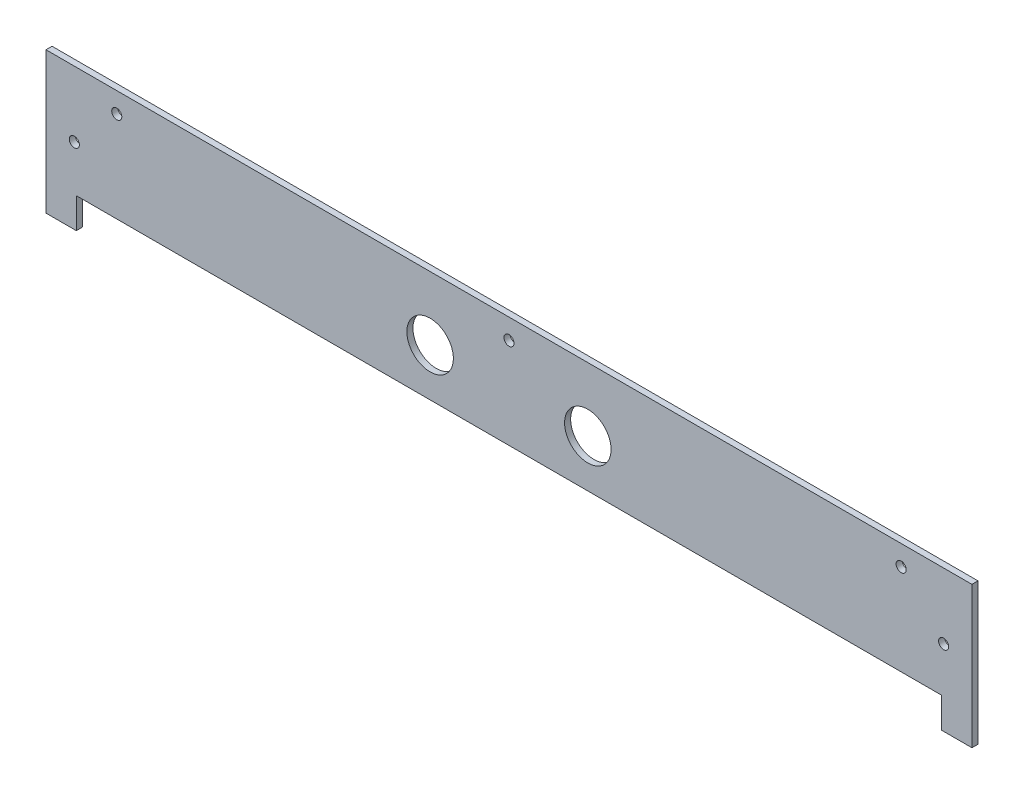
ISO-10303-21;
HEADER;
FILE_DESCRIPTION(('STEP AP214'),'2;1');
FILE_NAME('part.step','',(''),(''),'','','');
FILE_SCHEMA(('AUTOMOTIVE_DESIGN { 1 0 10303 214 1 1 1 1 }'));
ENDSEC;
DATA;
#1=APPLICATION_CONTEXT('core data for automotive mechanical design processes');
#2=APPLICATION_PROTOCOL_DEFINITION('international standard','automotive_design',2000,#1);
#3=PRODUCT_CONTEXT('',#1,'mechanical');
#4=PRODUCT('Part','Part','',(#3));
#5=PRODUCT_RELATED_PRODUCT_CATEGORY('part','',(#4));
#6=PRODUCT_DEFINITION_FORMATION('','',#4);
#7=PRODUCT_DEFINITION_CONTEXT('part definition',#1,'design');
#8=PRODUCT_DEFINITION('design','',#6,#7);
#9=PRODUCT_DEFINITION_SHAPE('','',#8);
#10=(LENGTH_UNIT() NAMED_UNIT(*) SI_UNIT(.MILLI.,.METRE.));
#11=(NAMED_UNIT(*) PLANE_ANGLE_UNIT() SI_UNIT($,.RADIAN.));
#12=(NAMED_UNIT(*) SI_UNIT($,.STERADIAN.) SOLID_ANGLE_UNIT());
#13=UNCERTAINTY_MEASURE_WITH_UNIT(LENGTH_MEASURE(1.E-05),#10,'distance_accuracy_value','');
#14=(GEOMETRIC_REPRESENTATION_CONTEXT(3) GLOBAL_UNCERTAINTY_ASSIGNED_CONTEXT((#13)) GLOBAL_UNIT_ASSIGNED_CONTEXT((#10,
#11,#12)) REPRESENTATION_CONTEXT('',''));
#15=CARTESIAN_POINT('',(0.,0.,0.));
#16=DIRECTION('',(0.,0.,1.));
#17=DIRECTION('',(1.,0.,0.));
#18=AXIS2_PLACEMENT_3D('',#15,#16,#17);
#19=CARTESIAN_POINT('',(229.,122.5,3.));
#20=DIRECTION('',(-1.,0.,0.));
#21=DIRECTION('',(0.,-1.,0.));
#22=AXIS2_PLACEMENT_3D('',#19,#20,#21);
#23=PLANE('',#22);
#24=DIRECTION('',(0.,1.,0.));
#25=VECTOR('',#24,1.);
#26=CARTESIAN_POINT('',(229.,122.5,3.));
#27=LINE('',#26,#25);
#28=CARTESIAN_POINT('',(229.,52.5,3.));
#29=VERTEX_POINT('',#28);
#30=CARTESIAN_POINT('',(229.,122.5,3.));
#31=VERTEX_POINT('',#30);
#32=EDGE_CURVE('E115',#29,#31,#27,.T.);
#33=ORIENTED_EDGE('',*,*,#32,.F.);
#34=DIRECTION('',(0.,0.,1.));
#35=VECTOR('',#34,1.);
#36=CARTESIAN_POINT('',(229.,52.5,-7.));
#37=LINE('',#36,#35);
#38=CARTESIAN_POINT('',(229.,52.5,0.));
#39=VERTEX_POINT('',#38);
#40=EDGE_CURVE('E102',#39,#29,#37,.T.);
#41=ORIENTED_EDGE('',*,*,#40,.F.);
#42=DIRECTION('',(0.,1.,0.));
#43=VECTOR('',#42,1.);
#44=CARTESIAN_POINT('',(229.,122.5,0.));
#45=LINE('',#44,#43);
#46=CARTESIAN_POINT('',(229.,122.5,0.));
#47=VERTEX_POINT('',#46);
#48=EDGE_CURVE('E138',#39,#47,#45,.T.);
#49=ORIENTED_EDGE('',*,*,#48,.T.);
#50=DIRECTION('',(0.,0.,-1.));
#51=VECTOR('',#50,1.);
#52=CARTESIAN_POINT('',(229.,122.5,3.));
#53=LINE('',#52,#51);
#54=EDGE_CURVE('E48',#31,#47,#53,.T.);
#55=ORIENTED_EDGE('',*,*,#54,.F.);
#56=EDGE_LOOP('',(#33,#41,#49,#55));
#57=FACE_BOUND('',#56,.T.);
#58=ADVANCED_FACE('F41',(#57),#23,.F.);
#59=CARTESIAN_POINT('',(-229.,122.5,3.));
#60=DIRECTION('',(0.,-1.,0.));
#61=DIRECTION('',(0.,0.,-1.));
#62=AXIS2_PLACEMENT_3D('',#59,#60,#61);
#63=PLANE('',#62);
#64=DIRECTION('',(-1.,0.,0.));
#65=VECTOR('',#64,1.);
#66=CARTESIAN_POINT('',(-229.,122.5,0.));
#67=LINE('',#66,#65);
#68=CARTESIAN_POINT('',(-229.,122.5,0.));
#69=VERTEX_POINT('',#68);
#70=EDGE_CURVE('E129',#47,#69,#67,.T.);
#71=ORIENTED_EDGE('',*,*,#70,.T.);
#72=DIRECTION('',(0.,0.,-1.));
#73=VECTOR('',#72,1.);
#74=CARTESIAN_POINT('',(-229.,122.5,3.));
#75=LINE('',#74,#73);
#76=CARTESIAN_POINT('',(-229.,122.5,3.));
#77=VERTEX_POINT('',#76);
#78=EDGE_CURVE('E137',#77,#69,#75,.T.);
#79=ORIENTED_EDGE('',*,*,#78,.F.);
#80=DIRECTION('',(-1.,0.,0.));
#81=VECTOR('',#80,1.);
#82=CARTESIAN_POINT('',(-229.,122.5,3.));
#83=LINE('',#82,#81);
#84=EDGE_CURVE('E123',#31,#77,#83,.T.);
#85=ORIENTED_EDGE('',*,*,#84,.F.);
#86=ORIENTED_EDGE('',*,*,#54,.T.);
#87=EDGE_LOOP('',(#71,#79,#85,#86));
#88=FACE_BOUND('',#87,.T.);
#89=ADVANCED_FACE('F144',(#88),#63,.F.);
#90=CARTESIAN_POINT('',(-229.,122.5,3.));
#91=DIRECTION('',(1.,0.,0.));
#92=DIRECTION('',(0.,0.,-1.));
#93=AXIS2_PLACEMENT_3D('',#90,#91,#92);
#94=PLANE('',#93);
#95=DIRECTION('',(0.,-1.,0.));
#96=VECTOR('',#95,1.);
#97=CARTESIAN_POINT('',(-229.,122.5,0.));
#98=LINE('',#97,#96);
#99=CARTESIAN_POINT('',(-229.,52.5,0.));
#100=VERTEX_POINT('',#99);
#101=EDGE_CURVE('E124',#69,#100,#98,.T.);
#102=ORIENTED_EDGE('',*,*,#101,.T.);
#103=DIRECTION('',(0.,0.,1.));
#104=VECTOR('',#103,1.);
#105=CARTESIAN_POINT('',(-229.,52.5,-7.));
#106=LINE('',#105,#104);
#107=CARTESIAN_POINT('',(-229.,52.5,3.));
#108=VERTEX_POINT('',#107);
#109=EDGE_CURVE('E109',#100,#108,#106,.T.);
#110=ORIENTED_EDGE('',*,*,#109,.T.);
#111=DIRECTION('',(0.,-1.,0.));
#112=VECTOR('',#111,1.);
#113=CARTESIAN_POINT('',(-229.,122.5,3.));
#114=LINE('',#113,#112);
#115=EDGE_CURVE('E126',#77,#108,#114,.T.);
#116=ORIENTED_EDGE('',*,*,#115,.F.);
#117=ORIENTED_EDGE('',*,*,#78,.T.);
#118=EDGE_LOOP('',(#102,#110,#116,#117));
#119=FACE_BOUND('',#118,.T.);
#120=ADVANCED_FACE('F153',(#119),#94,.F.);
#121=CARTESIAN_POINT('',(0.,0.,3.));
#122=DIRECTION('',(0.,0.,1.));
#123=DIRECTION('',(1.,0.,0.));
#124=AXIS2_PLACEMENT_3D('',#121,#122,#123);
#125=PLANE('',#124);
#126=DIRECTION('',(-1.,0.,0.));
#127=VECTOR('',#126,1.);
#128=CARTESIAN_POINT('',(-229.,52.5,3.));
#129=LINE('',#128,#127);
#130=CARTESIAN_POINT('',(214.,52.5,3.));
#131=VERTEX_POINT('',#130);
#132=EDGE_CURVE('E63',#29,#131,#129,.T.);
#133=ORIENTED_EDGE('',*,*,#132,.F.);
#134=ORIENTED_EDGE('',*,*,#32,.T.);
#135=ORIENTED_EDGE('',*,*,#84,.T.);
#136=ORIENTED_EDGE('',*,*,#115,.T.);
#137=CARTESIAN_POINT('',(-214.,52.5,3.));
#138=VERTEX_POINT('',#137);
#139=EDGE_CURVE('E119',#138,#108,#129,.T.);
#140=ORIENTED_EDGE('',*,*,#139,.F.);
#141=DIRECTION('',(0.,-1.,0.));
#142=VECTOR('',#141,1.);
#143=CARTESIAN_POINT('',(-214.,67.5,3.));
#144=LINE('',#143,#142);
#145=CARTESIAN_POINT('',(-214.,67.5,3.));
#146=VERTEX_POINT('',#145);
#147=EDGE_CURVE('E170',#146,#138,#144,.T.);
#148=ORIENTED_EDGE('',*,*,#147,.F.);
#149=DIRECTION('',(-1.,0.,0.));
#150=VECTOR('',#149,1.);
#151=CARTESIAN_POINT('',(214.,67.5,3.));
#152=LINE('',#151,#150);
#153=CARTESIAN_POINT('',(214.,67.5,3.));
#154=VERTEX_POINT('',#153);
#155=EDGE_CURVE('E164',#154,#146,#152,.T.);
#156=ORIENTED_EDGE('',*,*,#155,.F.);
#157=DIRECTION('',(0.,1.,0.));
#158=VECTOR('',#157,1.);
#159=CARTESIAN_POINT('',(214.,38.5,3.));
#160=LINE('',#159,#158);
#161=EDGE_CURVE('E118',#131,#154,#160,.T.);
#162=ORIENTED_EDGE('',*,*,#161,.F.);
#163=EDGE_LOOP('',(#133,#134,#135,#136,#140,#148,#156,#162));
#164=FACE_BOUND('',#163,.T.);
#165=CARTESIAN_POINT('',(-39.,91.,3.));
#166=DIRECTION('',(0.,0.,1.));
#167=DIRECTION('',(1.,0.,0.));
#168=AXIS2_PLACEMENT_3D('',#165,#166,#167);
#169=CIRCLE('',#168,11.5);
#170=CARTESIAN_POINT('',(-27.5,91.,3.));
#171=VERTEX_POINT('',#170);
#172=EDGE_CURVE('E184',#171,#171,#169,.T.);
#173=ORIENTED_EDGE('',*,*,#172,.F.);
#174=EDGE_LOOP('',(#173));
#175=FACE_BOUND('',#174,.T.);
#176=CARTESIAN_POINT('',(39.,91.,3.));
#177=DIRECTION('',(0.,0.,1.));
#178=DIRECTION('',(1.,0.,0.));
#179=AXIS2_PLACEMENT_3D('',#176,#177,#178);
#180=CIRCLE('',#179,11.5);
#181=CARTESIAN_POINT('',(50.5,91.,3.));
#182=VERTEX_POINT('',#181);
#183=EDGE_CURVE('E187',#182,#182,#180,.T.);
#184=ORIENTED_EDGE('',*,*,#183,.F.);
#185=EDGE_LOOP('',(#184));
#186=FACE_BOUND('',#185,.T.);
#187=CARTESIAN_POINT('',(-215.,89.9999999999999,3.));
#188=DIRECTION('',(0.,0.,1.));
#189=DIRECTION('',(1.,0.,0.));
#190=AXIS2_PLACEMENT_3D('',#187,#188,#189);
#191=CIRCLE('',#190,2.49999999999997);
#192=CARTESIAN_POINT('',(-212.5,89.9999999999999,3.));
#193=VERTEX_POINT('',#192);
#194=EDGE_CURVE('E204',#193,#193,#191,.T.);
#195=ORIENTED_EDGE('',*,*,#194,.F.);
#196=EDGE_LOOP('',(#195));
#197=FACE_BOUND('',#196,.T.);
#198=CARTESIAN_POINT('',(194.,112.5,3.));
#199=DIRECTION('',(0.,0.,1.));
#200=DIRECTION('',(1.,0.,0.));
#201=AXIS2_PLACEMENT_3D('',#198,#199,#200);
#202=CIRCLE('',#201,2.5000000000002);
#203=CARTESIAN_POINT('',(196.5,112.5,3.));
#204=VERTEX_POINT('',#203);
#205=EDGE_CURVE('E210',#204,#204,#202,.T.);
#206=ORIENTED_EDGE('',*,*,#205,.F.);
#207=EDGE_LOOP('',(#206));
#208=FACE_BOUND('',#207,.T.);
#209=CARTESIAN_POINT('',(215.,90.,3.));
#210=DIRECTION('',(0.,0.,1.));
#211=DIRECTION('',(1.,0.,0.));
#212=AXIS2_PLACEMENT_3D('',#209,#210,#211);
#213=CIRCLE('',#212,2.50000000000002);
#214=CARTESIAN_POINT('',(217.5,90.,3.));
#215=VERTEX_POINT('',#214);
#216=EDGE_CURVE('E192',#215,#215,#213,.T.);
#217=ORIENTED_EDGE('',*,*,#216,.F.);
#218=EDGE_LOOP('',(#217));
#219=FACE_BOUND('',#218,.T.);
#220=CARTESIAN_POINT('',(0.,112.5,3.));
#221=DIRECTION('',(0.,0.,1.));
#222=DIRECTION('',(1.,0.,0.));
#223=AXIS2_PLACEMENT_3D('',#220,#221,#222);
#224=CIRCLE('',#223,2.50000000000001);
#225=CARTESIAN_POINT('',(2.50000000000002,112.5,3.));
#226=VERTEX_POINT('',#225);
#227=EDGE_CURVE('E199',#226,#226,#224,.T.);
#228=ORIENTED_EDGE('',*,*,#227,.F.);
#229=EDGE_LOOP('',(#228));
#230=FACE_BOUND('',#229,.T.);
#231=CARTESIAN_POINT('',(-194.,112.5,3.));
#232=DIRECTION('',(0.,0.,1.));
#233=DIRECTION('',(1.,0.,0.));
#234=AXIS2_PLACEMENT_3D('',#231,#232,#233);
#235=CIRCLE('',#234,2.50000000000002);
#236=CARTESIAN_POINT('',(-191.5,112.5,3.));
#237=VERTEX_POINT('',#236);
#238=EDGE_CURVE('E132',#237,#237,#235,.T.);
#239=ORIENTED_EDGE('',*,*,#238,.F.);
#240=EDGE_LOOP('',(#239));
#241=FACE_BOUND('',#240,.T.);
#242=ADVANCED_FACE('F113',(#164,#175,#186,#197,#208,#219,#230,#241),#125,.T.);
#243=CARTESIAN_POINT('',(0.,0.,0.));
#244=DIRECTION('',(0.,0.,1.));
#245=DIRECTION('',(1.,0.,0.));
#246=AXIS2_PLACEMENT_3D('',#243,#244,#245);
#247=PLANE('',#246);
#248=ORIENTED_EDGE('',*,*,#48,.F.);
#249=DIRECTION('',(-1.,0.,0.));
#250=VECTOR('',#249,1.);
#251=CARTESIAN_POINT('',(0.,52.5,0.));
#252=LINE('',#251,#250);
#253=CARTESIAN_POINT('',(214.,52.5,0.));
#254=VERTEX_POINT('',#253);
#255=EDGE_CURVE('E105',#39,#254,#252,.T.);
#256=ORIENTED_EDGE('',*,*,#255,.T.);
#257=DIRECTION('',(0.,1.,0.));
#258=VECTOR('',#257,1.);
#259=CARTESIAN_POINT('',(214.,38.5,0.));
#260=LINE('',#259,#258);
#261=CARTESIAN_POINT('',(214.,67.5,0.));
#262=VERTEX_POINT('',#261);
#263=EDGE_CURVE('E163',#254,#262,#260,.T.);
#264=ORIENTED_EDGE('',*,*,#263,.T.);
#265=DIRECTION('',(-1.,0.,0.));
#266=VECTOR('',#265,1.);
#267=CARTESIAN_POINT('',(214.,67.5,0.));
#268=LINE('',#267,#266);
#269=CARTESIAN_POINT('',(-214.,67.5,0.));
#270=VERTEX_POINT('',#269);
#271=EDGE_CURVE('E166',#262,#270,#268,.T.);
#272=ORIENTED_EDGE('',*,*,#271,.T.);
#273=DIRECTION('',(0.,-1.,0.));
#274=VECTOR('',#273,1.);
#275=CARTESIAN_POINT('',(-214.,67.5,0.));
#276=LINE('',#275,#274);
#277=CARTESIAN_POINT('',(-214.,52.5,0.));
#278=VERTEX_POINT('',#277);
#279=EDGE_CURVE('E160',#270,#278,#276,.T.);
#280=ORIENTED_EDGE('',*,*,#279,.T.);
#281=EDGE_CURVE('E55',#278,#100,#252,.T.);
#282=ORIENTED_EDGE('',*,*,#281,.T.);
#283=ORIENTED_EDGE('',*,*,#101,.F.);
#284=ORIENTED_EDGE('',*,*,#70,.F.);
#285=EDGE_LOOP('',(#248,#256,#264,#272,#280,#282,#283,#284));
#286=FACE_BOUND('',#285,.T.);
#287=CARTESIAN_POINT('',(-39.,91.,0.));
#288=DIRECTION('',(0.,0.,1.));
#289=DIRECTION('',(1.,0.,0.));
#290=AXIS2_PLACEMENT_3D('',#287,#288,#289);
#291=CIRCLE('',#290,11.5);
#292=CARTESIAN_POINT('',(-27.5,91.,0.));
#293=VERTEX_POINT('',#292);
#294=EDGE_CURVE('E180',#293,#293,#291,.T.);
#295=ORIENTED_EDGE('',*,*,#294,.T.);
#296=EDGE_LOOP('',(#295));
#297=FACE_BOUND('',#296,.T.);
#298=CARTESIAN_POINT('',(39.,91.,0.));
#299=DIRECTION('',(0.,0.,1.));
#300=DIRECTION('',(1.,0.,0.));
#301=AXIS2_PLACEMENT_3D('',#298,#299,#300);
#302=CIRCLE('',#301,11.5);
#303=CARTESIAN_POINT('',(50.5,91.,0.));
#304=VERTEX_POINT('',#303);
#305=EDGE_CURVE('E177',#304,#304,#302,.T.);
#306=ORIENTED_EDGE('',*,*,#305,.T.);
#307=EDGE_LOOP('',(#306));
#308=FACE_BOUND('',#307,.T.);
#309=CARTESIAN_POINT('',(-215.,89.9999999999999,0.));
#310=DIRECTION('',(0.,0.,1.));
#311=DIRECTION('',(1.,0.,0.));
#312=AXIS2_PLACEMENT_3D('',#309,#310,#311);
#313=CIRCLE('',#312,2.49999999999997);
#314=CARTESIAN_POINT('',(-212.5,89.9999999999999,0.));
#315=VERTEX_POINT('',#314);
#316=EDGE_CURVE('E195',#315,#315,#313,.T.);
#317=ORIENTED_EDGE('',*,*,#316,.T.);
#318=EDGE_LOOP('',(#317));
#319=FACE_BOUND('',#318,.T.);
#320=CARTESIAN_POINT('',(194.,112.5,0.));
#321=DIRECTION('',(0.,0.,1.));
#322=DIRECTION('',(1.,0.,0.));
#323=AXIS2_PLACEMENT_3D('',#320,#321,#322);
#324=CIRCLE('',#323,2.5000000000002);
#325=CARTESIAN_POINT('',(196.5,112.5,0.));
#326=VERTEX_POINT('',#325);
#327=EDGE_CURVE('E207',#326,#326,#324,.T.);
#328=ORIENTED_EDGE('',*,*,#327,.T.);
#329=EDGE_LOOP('',(#328));
#330=FACE_BOUND('',#329,.T.);
#331=CARTESIAN_POINT('',(215.,90.,0.));
#332=DIRECTION('',(0.,0.,1.));
#333=DIRECTION('',(1.,0.,0.));
#334=AXIS2_PLACEMENT_3D('',#331,#332,#333);
#335=CIRCLE('',#334,2.50000000000002);
#336=CARTESIAN_POINT('',(217.5,90.,0.));
#337=VERTEX_POINT('',#336);
#338=EDGE_CURVE('E196',#337,#337,#335,.T.);
#339=ORIENTED_EDGE('',*,*,#338,.T.);
#340=EDGE_LOOP('',(#339));
#341=FACE_BOUND('',#340,.T.);
#342=CARTESIAN_POINT('',(0.,112.5,0.));
#343=DIRECTION('',(0.,0.,1.));
#344=DIRECTION('',(1.,0.,0.));
#345=AXIS2_PLACEMENT_3D('',#342,#343,#344);
#346=CIRCLE('',#345,2.50000000000001);
#347=CARTESIAN_POINT('',(2.50000000000002,112.5,0.));
#348=VERTEX_POINT('',#347);
#349=EDGE_CURVE('E183',#348,#348,#346,.T.);
#350=ORIENTED_EDGE('',*,*,#349,.T.);
#351=EDGE_LOOP('',(#350));
#352=FACE_BOUND('',#351,.T.);
#353=CARTESIAN_POINT('',(-194.,112.5,0.));
#354=DIRECTION('',(0.,0.,1.));
#355=DIRECTION('',(1.,0.,0.));
#356=AXIS2_PLACEMENT_3D('',#353,#354,#355);
#357=CIRCLE('',#356,2.50000000000002);
#358=CARTESIAN_POINT('',(-191.5,112.5,0.));
#359=VERTEX_POINT('',#358);
#360=EDGE_CURVE('E140',#359,#359,#357,.T.);
#361=ORIENTED_EDGE('',*,*,#360,.T.);
#362=EDGE_LOOP('',(#361));
#363=FACE_BOUND('',#362,.T.);
#364=ADVANCED_FACE('F223',(#286,#297,#308,#319,#330,#341,#352,#363),#247,.F.);
#365=CARTESIAN_POINT('',(-194.,112.5,0.));
#366=DIRECTION('',(0.,0.,1.));
#367=DIRECTION('',(1.,0.,0.));
#368=AXIS2_PLACEMENT_3D('',#365,#366,#367);
#369=CYLINDRICAL_SURFACE('',#368,2.50000000000002);
#370=ORIENTED_EDGE('',*,*,#360,.F.);
#371=EDGE_LOOP('',(#370));
#372=FACE_BOUND('',#371,.T.);
#373=ORIENTED_EDGE('',*,*,#238,.T.);
#374=EDGE_LOOP('',(#373));
#375=FACE_BOUND('',#374,.T.);
#376=ADVANCED_FACE('F220',(#372,#375),#369,.F.);
#377=CARTESIAN_POINT('',(0.,112.5,0.));
#378=DIRECTION('',(0.,0.,1.));
#379=DIRECTION('',(1.,0.,0.));
#380=AXIS2_PLACEMENT_3D('',#377,#378,#379);
#381=CYLINDRICAL_SURFACE('',#380,2.50000000000001);
#382=ORIENTED_EDGE('',*,*,#349,.F.);
#383=EDGE_LOOP('',(#382));
#384=FACE_BOUND('',#383,.T.);
#385=ORIENTED_EDGE('',*,*,#227,.T.);
#386=EDGE_LOOP('',(#385));
#387=FACE_BOUND('',#386,.T.);
#388=ADVANCED_FACE('F365',(#384,#387),#381,.F.);
#389=CARTESIAN_POINT('',(215.,90.,0.));
#390=DIRECTION('',(0.,0.,1.));
#391=DIRECTION('',(1.,0.,0.));
#392=AXIS2_PLACEMENT_3D('',#389,#390,#391);
#393=CYLINDRICAL_SURFACE('',#392,2.50000000000002);
#394=ORIENTED_EDGE('',*,*,#338,.F.);
#395=EDGE_LOOP('',(#394));
#396=FACE_BOUND('',#395,.T.);
#397=ORIENTED_EDGE('',*,*,#216,.T.);
#398=EDGE_LOOP('',(#397));
#399=FACE_BOUND('',#398,.T.);
#400=ADVANCED_FACE('F355',(#396,#399),#393,.F.);
#401=CARTESIAN_POINT('',(194.,112.5,0.));
#402=DIRECTION('',(0.,0.,1.));
#403=DIRECTION('',(1.,0.,0.));
#404=AXIS2_PLACEMENT_3D('',#401,#402,#403);
#405=CYLINDRICAL_SURFACE('',#404,2.5000000000002);
#406=ORIENTED_EDGE('',*,*,#327,.F.);
#407=EDGE_LOOP('',(#406));
#408=FACE_BOUND('',#407,.T.);
#409=ORIENTED_EDGE('',*,*,#205,.T.);
#410=EDGE_LOOP('',(#409));
#411=FACE_BOUND('',#410,.T.);
#412=ADVANCED_FACE('F345',(#408,#411),#405,.F.);
#413=CARTESIAN_POINT('',(-215.,89.9999999999999,0.));
#414=DIRECTION('',(0.,0.,1.));
#415=DIRECTION('',(1.,0.,0.));
#416=AXIS2_PLACEMENT_3D('',#413,#414,#415);
#417=CYLINDRICAL_SURFACE('',#416,2.49999999999997);
#418=ORIENTED_EDGE('',*,*,#316,.F.);
#419=EDGE_LOOP('',(#418));
#420=FACE_BOUND('',#419,.T.);
#421=ORIENTED_EDGE('',*,*,#194,.T.);
#422=EDGE_LOOP('',(#421));
#423=FACE_BOUND('',#422,.T.);
#424=ADVANCED_FACE('F335',(#420,#423),#417,.F.);
#425=CARTESIAN_POINT('',(39.,91.,0.));
#426=DIRECTION('',(0.,0.,1.));
#427=DIRECTION('',(1.,0.,0.));
#428=AXIS2_PLACEMENT_3D('',#425,#426,#427);
#429=CYLINDRICAL_SURFACE('',#428,11.5);
#430=ORIENTED_EDGE('',*,*,#305,.F.);
#431=EDGE_LOOP('',(#430));
#432=FACE_BOUND('',#431,.T.);
#433=ORIENTED_EDGE('',*,*,#183,.T.);
#434=EDGE_LOOP('',(#433));
#435=FACE_BOUND('',#434,.T.);
#436=ADVANCED_FACE('F325',(#432,#435),#429,.F.);
#437=CARTESIAN_POINT('',(-39.,91.,0.));
#438=DIRECTION('',(0.,0.,1.));
#439=DIRECTION('',(1.,0.,0.));
#440=AXIS2_PLACEMENT_3D('',#437,#438,#439);
#441=CYLINDRICAL_SURFACE('',#440,11.5);
#442=ORIENTED_EDGE('',*,*,#294,.F.);
#443=EDGE_LOOP('',(#442));
#444=FACE_BOUND('',#443,.T.);
#445=ORIENTED_EDGE('',*,*,#172,.T.);
#446=EDGE_LOOP('',(#445));
#447=FACE_BOUND('',#446,.T.);
#448=ADVANCED_FACE('F273',(#444,#447),#441,.F.);
#449=CARTESIAN_POINT('',(-214.,67.5,0.));
#450=DIRECTION('',(-1.,0.,0.));
#451=DIRECTION('',(0.,0.,1.));
#452=AXIS2_PLACEMENT_3D('',#449,#450,#451);
#453=PLANE('',#452);
#454=ORIENTED_EDGE('',*,*,#147,.T.);
#455=DIRECTION('',(0.,0.,-1.));
#456=VECTOR('',#455,1.);
#457=CARTESIAN_POINT('',(-214.,52.5,0.));
#458=LINE('',#457,#456);
#459=EDGE_CURVE('E156',#138,#278,#458,.T.);
#460=ORIENTED_EDGE('',*,*,#459,.T.);
#461=ORIENTED_EDGE('',*,*,#279,.F.);
#462=DIRECTION('',(0.,0.,1.));
#463=VECTOR('',#462,1.);
#464=CARTESIAN_POINT('',(-214.,67.5,0.));
#465=LINE('',#464,#463);
#466=EDGE_CURVE('E175',#270,#146,#465,.T.);
#467=ORIENTED_EDGE('',*,*,#466,.T.);
#468=EDGE_LOOP('',(#454,#460,#461,#467));
#469=FACE_BOUND('',#468,.T.);
#470=ADVANCED_FACE('F267',(#469),#453,.F.);
#471=CARTESIAN_POINT('',(214.,67.5,0.));
#472=DIRECTION('',(0.,1.,0.));
#473=DIRECTION('',(0.,0.,1.));
#474=AXIS2_PLACEMENT_3D('',#471,#472,#473);
#475=PLANE('',#474);
#476=ORIENTED_EDGE('',*,*,#155,.T.);
#477=ORIENTED_EDGE('',*,*,#466,.F.);
#478=ORIENTED_EDGE('',*,*,#271,.F.);
#479=DIRECTION('',(0.,0.,1.));
#480=VECTOR('',#479,1.);
#481=CARTESIAN_POINT('',(214.,67.5,0.));
#482=LINE('',#481,#480);
#483=EDGE_CURVE('E169',#262,#154,#482,.T.);
#484=ORIENTED_EDGE('',*,*,#483,.T.);
#485=EDGE_LOOP('',(#476,#477,#478,#484));
#486=FACE_BOUND('',#485,.T.);
#487=ADVANCED_FACE('F272',(#486),#475,.F.);
#488=CARTESIAN_POINT('',(214.,38.5,0.));
#489=DIRECTION('',(1.,0.,0.));
#490=DIRECTION('',(0.,0.,-1.));
#491=AXIS2_PLACEMENT_3D('',#488,#489,#490);
#492=PLANE('',#491);
#493=ORIENTED_EDGE('',*,*,#263,.F.);
#494=DIRECTION('',(0.,0.,1.));
#495=VECTOR('',#494,1.);
#496=CARTESIAN_POINT('',(214.,52.5,0.));
#497=LINE('',#496,#495);
#498=EDGE_CURVE('E11',#254,#131,#497,.T.);
#499=ORIENTED_EDGE('',*,*,#498,.T.);
#500=ORIENTED_EDGE('',*,*,#161,.T.);
#501=ORIENTED_EDGE('',*,*,#483,.F.);
#502=EDGE_LOOP('',(#493,#499,#500,#501));
#503=FACE_BOUND('',#502,.T.);
#504=ADVANCED_FACE('F284',(#503),#492,.F.);
#505=CARTESIAN_POINT('',(-229.,52.5,-7.));
#506=DIRECTION('',(0.,1.,0.));
#507=DIRECTION('',(0.,0.,1.));
#508=AXIS2_PLACEMENT_3D('',#505,#506,#507);
#509=PLANE('',#508);
#510=ORIENTED_EDGE('',*,*,#40,.T.);
#511=ORIENTED_EDGE('',*,*,#132,.T.);
#512=ORIENTED_EDGE('',*,*,#498,.F.);
#513=ORIENTED_EDGE('',*,*,#255,.F.);
#514=EDGE_LOOP('',(#510,#511,#512,#513));
#515=FACE_BOUND('',#514,.T.);
#516=ADVANCED_FACE('F103',(#515),#509,.F.);
#517=ORIENTED_EDGE('',*,*,#459,.F.);
#518=ORIENTED_EDGE('',*,*,#139,.T.);
#519=ORIENTED_EDGE('',*,*,#109,.F.);
#520=ORIENTED_EDGE('',*,*,#281,.F.);
#521=EDGE_LOOP('',(#517,#518,#519,#520));
#522=FACE_BOUND('',#521,.T.);
#523=ADVANCED_FACE('F299',(#522),#509,.F.);
#524=CLOSED_SHELL('',(#58,#89,#120,#242,#364,#376,#388,#400,#412,#424,#436,#448,#470,#487,#504,
#516,#523));
#525=MANIFOLD_SOLID_BREP('B2',#524);
#526=ADVANCED_BREP_SHAPE_REPRESENTATION('',(#18,#525),#14);
#527=SHAPE_DEFINITION_REPRESENTATION(#9,#526);
ENDSEC;
END-ISO-10303-21;
